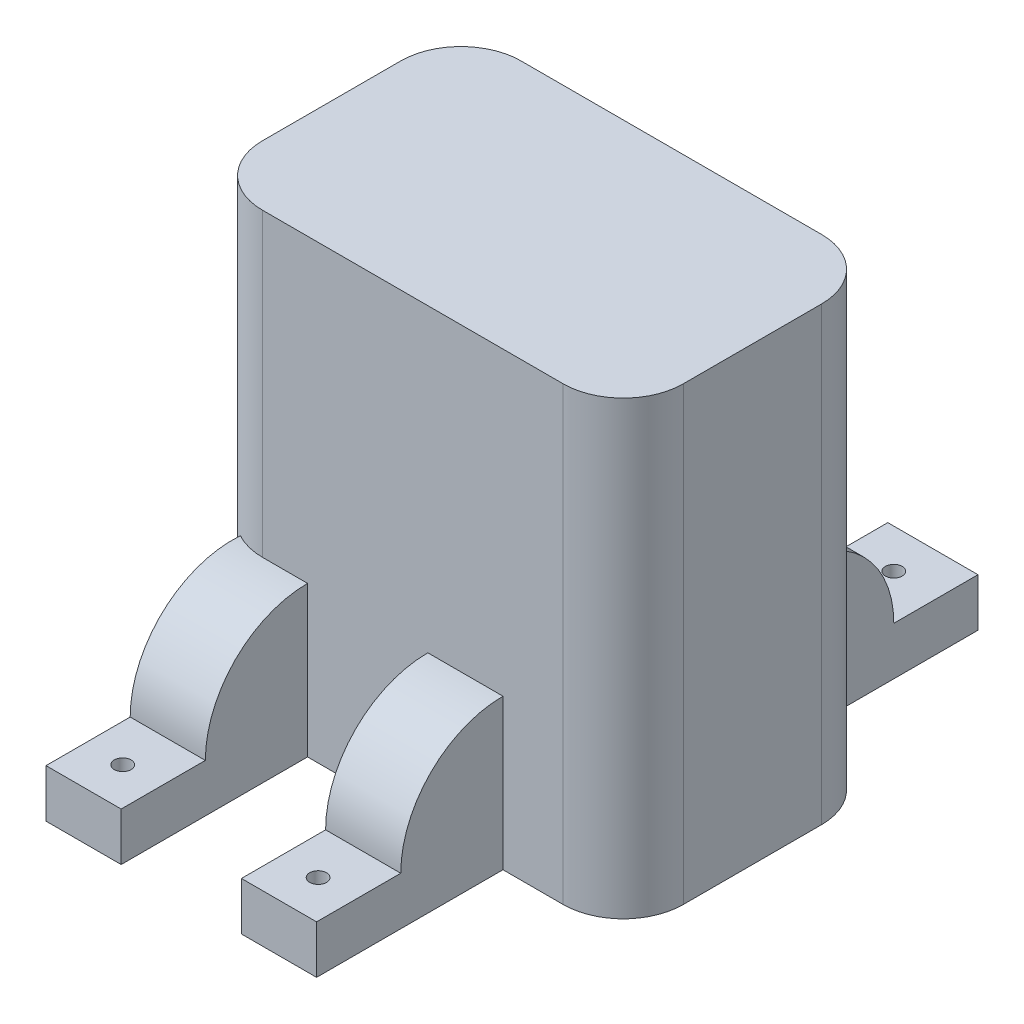
ISO-10303-21;
HEADER;
FILE_DESCRIPTION(('STEP AP214'),'2;1');
FILE_NAME('part.step','',(''),(''),'','','');
FILE_SCHEMA(('AUTOMOTIVE_DESIGN { 1 0 10303 214 1 1 1 1 }'));
ENDSEC;
DATA;
#1=APPLICATION_CONTEXT('core data for automotive mechanical design processes');
#2=APPLICATION_PROTOCOL_DEFINITION('international standard','automotive_design',2000,#1);
#3=PRODUCT_CONTEXT('',#1,'mechanical');
#4=PRODUCT('Part','Part','',(#3));
#5=PRODUCT_RELATED_PRODUCT_CATEGORY('part','',(#4));
#6=PRODUCT_DEFINITION_FORMATION('','',#4);
#7=PRODUCT_DEFINITION_CONTEXT('part definition',#1,'design');
#8=PRODUCT_DEFINITION('design','',#6,#7);
#9=PRODUCT_DEFINITION_SHAPE('','',#8);
#10=(LENGTH_UNIT() NAMED_UNIT(*) SI_UNIT(.MILLI.,.METRE.));
#11=(NAMED_UNIT(*) PLANE_ANGLE_UNIT() SI_UNIT($,.RADIAN.));
#12=(NAMED_UNIT(*) SI_UNIT($,.STERADIAN.) SOLID_ANGLE_UNIT());
#13=UNCERTAINTY_MEASURE_WITH_UNIT(LENGTH_MEASURE(1.E-05),#10,'distance_accuracy_value','');
#14=(GEOMETRIC_REPRESENTATION_CONTEXT(3) GLOBAL_UNCERTAINTY_ASSIGNED_CONTEXT((#13)) GLOBAL_UNIT_ASSIGNED_CONTEXT((#10,
#11,#12)) REPRESENTATION_CONTEXT('',''));
#15=CARTESIAN_POINT('',(0.,0.,0.));
#16=DIRECTION('',(0.,0.,1.));
#17=DIRECTION('',(1.,0.,0.));
#18=AXIS2_PLACEMENT_3D('',#15,#16,#17);
#19=CARTESIAN_POINT('',(0.,0.,0.));
#20=DIRECTION('',(0.,-1.,0.));
#21=DIRECTION('',(0.,0.,-1.));
#22=AXIS2_PLACEMENT_3D('',#19,#20,#21);
#23=PLANE('',#22);
#24=CARTESIAN_POINT('',(4.75,0.,-6.75));
#25=DIRECTION('',(0.,1.,0.));
#26=DIRECTION('',(0.,0.,1.));
#27=AXIS2_PLACEMENT_3D('',#24,#25,#26);
#28=CIRCLE('',#27,0.140000000000001);
#29=CARTESIAN_POINT('',(4.75,0.,-6.61));
#30=VERTEX_POINT('',#29);
#31=EDGE_CURVE('E269',#30,#30,#28,.T.);
#32=ORIENTED_EDGE('',*,*,#31,.T.);
#33=EDGE_LOOP('',(#32));
#34=FACE_BOUND('',#33,.T.);
#35=CARTESIAN_POINT('',(1.125,0.,2.45));
#36=DIRECTION('',(0.,1.,0.));
#37=DIRECTION('',(0.,0.,1.));
#38=AXIS2_PLACEMENT_3D('',#35,#36,#37);
#39=CIRCLE('',#38,0.14);
#40=CARTESIAN_POINT('',(1.125,0.,2.59));
#41=VERTEX_POINT('',#40);
#42=EDGE_CURVE('E278',#41,#41,#39,.T.);
#43=ORIENTED_EDGE('',*,*,#42,.T.);
#44=EDGE_LOOP('',(#43));
#45=FACE_BOUND('',#44,.T.);
#46=CARTESIAN_POINT('',(4.375,0.,2.45));
#47=DIRECTION('',(0.,1.,0.));
#48=DIRECTION('',(0.,0.,1.));
#49=AXIS2_PLACEMENT_3D('',#46,#47,#48);
#50=CIRCLE('',#49,0.14);
#51=CARTESIAN_POINT('',(4.375,0.,2.59));
#52=VERTEX_POINT('',#51);
#53=EDGE_CURVE('E266',#52,#52,#50,.T.);
#54=ORIENTED_EDGE('',*,*,#53,.T.);
#55=EDGE_LOOP('',(#54));
#56=FACE_BOUND('',#55,.T.);
#57=DIRECTION('',(0.,0.,-1.));
#58=VECTOR('',#57,1.);
#59=CARTESIAN_POINT('',(0.5,0.,3.1));
#60=LINE('',#59,#58);
#61=CARTESIAN_POINT('',(0.5,0.,3.1));
#62=VERTEX_POINT('',#61);
#63=CARTESIAN_POINT('',(0.5,0.,-0.133974596215561));
#64=VERTEX_POINT('',#63);
#65=EDGE_CURVE('E318',#62,#64,#60,.T.);
#66=ORIENTED_EDGE('',*,*,#65,.T.);
#67=CARTESIAN_POINT('',(1.,0.,-1.));
#68=DIRECTION('',(0.,-1.,0.));
#69=DIRECTION('',(0.,0.,-1.));
#70=AXIS2_PLACEMENT_3D('',#67,#68,#69);
#71=CIRCLE('',#70,1.);
#72=CARTESIAN_POINT('',(0.,0.,-1.));
#73=VERTEX_POINT('',#72);
#74=EDGE_CURVE('E420',#64,#73,#71,.T.);
#75=ORIENTED_EDGE('',*,*,#74,.T.);
#76=DIRECTION('',(0.,0.,1.));
#77=VECTOR('',#76,1.);
#78=CARTESIAN_POINT('',(0.,0.,0.));
#79=LINE('',#78,#77);
#80=CARTESIAN_POINT('',(0.,0.,-3.3));
#81=VERTEX_POINT('',#80);
#82=EDGE_CURVE('E359',#81,#73,#79,.T.);
#83=ORIENTED_EDGE('',*,*,#82,.F.);
#84=CARTESIAN_POINT('',(1.,0.,-3.3));
#85=DIRECTION('',(0.,-1.,0.));
#86=DIRECTION('',(0.,0.,-1.));
#87=AXIS2_PLACEMENT_3D('',#84,#85,#86);
#88=CIRCLE('',#87,1.);
#89=CARTESIAN_POINT('',(1.,0.,-4.3));
#90=VERTEX_POINT('',#89);
#91=EDGE_CURVE('E418',#81,#90,#88,.T.);
#92=ORIENTED_EDGE('',*,*,#91,.T.);
#93=DIRECTION('',(-1.,0.,0.));
#94=VECTOR('',#93,1.);
#95=CARTESIAN_POINT('',(0.,0.,-4.3));
#96=LINE('',#95,#94);
#97=CARTESIAN_POINT('',(4.,0.,-4.3));
#98=VERTEX_POINT('',#97);
#99=EDGE_CURVE('E408',#98,#90,#96,.T.);
#100=ORIENTED_EDGE('',*,*,#99,.F.);
#101=DIRECTION('',(0.,0.,1.));
#102=VECTOR('',#101,1.);
#103=CARTESIAN_POINT('',(4.,0.,-7.4));
#104=LINE('',#103,#102);
#105=CARTESIAN_POINT('',(4.,0.,-7.4));
#106=VERTEX_POINT('',#105);
#107=EDGE_CURVE('E302',#106,#98,#104,.T.);
#108=ORIENTED_EDGE('',*,*,#107,.F.);
#109=DIRECTION('',(-1.,0.,0.));
#110=VECTOR('',#109,1.);
#111=CARTESIAN_POINT('',(0.,0.,-7.4));
#112=LINE('',#111,#110);
#113=CARTESIAN_POINT('',(5.5,0.,-7.4));
#114=VERTEX_POINT('',#113);
#115=EDGE_CURVE('E229',#114,#106,#112,.T.);
#116=ORIENTED_EDGE('',*,*,#115,.F.);
#117=DIRECTION('',(0.,0.,1.));
#118=VECTOR('',#117,1.);
#119=CARTESIAN_POINT('',(5.5,0.,-7.4));
#120=LINE('',#119,#118);
#121=CARTESIAN_POINT('',(5.5,0.,-4.3));
#122=VERTEX_POINT('',#121);
#123=EDGE_CURVE('E295',#114,#122,#120,.T.);
#124=ORIENTED_EDGE('',*,*,#123,.T.);
#125=CARTESIAN_POINT('',(6.,0.,-4.3));
#126=VERTEX_POINT('',#125);
#127=EDGE_CURVE('E226',#126,#122,#96,.T.);
#128=ORIENTED_EDGE('',*,*,#127,.F.);
#129=CARTESIAN_POINT('',(6.,0.,-3.3));
#130=DIRECTION('',(0.,-1.,0.));
#131=DIRECTION('',(0.,0.,-1.));
#132=AXIS2_PLACEMENT_3D('',#129,#130,#131);
#133=CIRCLE('',#132,1.);
#134=CARTESIAN_POINT('',(7.,0.,-3.3));
#135=VERTEX_POINT('',#134);
#136=EDGE_CURVE('E416',#126,#135,#133,.T.);
#137=ORIENTED_EDGE('',*,*,#136,.T.);
#138=DIRECTION('',(0.,0.,-1.));
#139=VECTOR('',#138,1.);
#140=CARTESIAN_POINT('',(7.,0.,0.));
#141=LINE('',#140,#139);
#142=CARTESIAN_POINT('',(7.,0.,-1.));
#143=VERTEX_POINT('',#142);
#144=EDGE_CURVE('E405',#143,#135,#141,.T.);
#145=ORIENTED_EDGE('',*,*,#144,.F.);
#146=CARTESIAN_POINT('',(6.,0.,-1.));
#147=DIRECTION('',(0.,-1.,0.));
#148=DIRECTION('',(0.,0.,-1.));
#149=AXIS2_PLACEMENT_3D('',#146,#147,#148);
#150=CIRCLE('',#149,1.);
#151=CARTESIAN_POINT('',(6.,0.,0.));
#152=VERTEX_POINT('',#151);
#153=EDGE_CURVE('E414',#143,#152,#150,.T.);
#154=ORIENTED_EDGE('',*,*,#153,.T.);
#155=DIRECTION('',(1.,0.,0.));
#156=VECTOR('',#155,1.);
#157=CARTESIAN_POINT('',(0.,0.,0.));
#158=LINE('',#157,#156);
#159=CARTESIAN_POINT('',(5.,0.,0.));
#160=VERTEX_POINT('',#159);
#161=EDGE_CURVE('E401',#160,#152,#158,.T.);
#162=ORIENTED_EDGE('',*,*,#161,.F.);
#163=DIRECTION('',(0.,0.,-1.));
#164=VECTOR('',#163,1.);
#165=CARTESIAN_POINT('',(5.,0.,3.1));
#166=LINE('',#165,#164);
#167=CARTESIAN_POINT('',(5.,0.,3.1));
#168=VERTEX_POINT('',#167);
#169=EDGE_CURVE('E305',#168,#160,#166,.T.);
#170=ORIENTED_EDGE('',*,*,#169,.F.);
#171=DIRECTION('',(1.,0.,0.));
#172=VECTOR('',#171,1.);
#173=CARTESIAN_POINT('',(0.,0.,3.1));
#174=LINE('',#173,#172);
#175=CARTESIAN_POINT('',(3.75,0.,3.1));
#176=VERTEX_POINT('',#175);
#177=EDGE_CURVE('E345',#176,#168,#174,.T.);
#178=ORIENTED_EDGE('',*,*,#177,.F.);
#179=DIRECTION('',(0.,0.,-1.));
#180=VECTOR('',#179,1.);
#181=CARTESIAN_POINT('',(3.75,0.,3.1));
#182=LINE('',#181,#180);
#183=CARTESIAN_POINT('',(3.75,0.,0.));
#184=VERTEX_POINT('',#183);
#185=EDGE_CURVE('E339',#176,#184,#182,.T.);
#186=ORIENTED_EDGE('',*,*,#185,.T.);
#187=CARTESIAN_POINT('',(1.75,0.,0.));
#188=VERTEX_POINT('',#187);
#189=EDGE_CURVE('E404',#188,#184,#158,.T.);
#190=ORIENTED_EDGE('',*,*,#189,.F.);
#191=DIRECTION('',(0.,0.,-1.));
#192=VECTOR('',#191,1.);
#193=CARTESIAN_POINT('',(1.75,0.,3.1));
#194=LINE('',#193,#192);
#195=CARTESIAN_POINT('',(1.75,0.,3.1));
#196=VERTEX_POINT('',#195);
#197=EDGE_CURVE('E327',#196,#188,#194,.T.);
#198=ORIENTED_EDGE('',*,*,#197,.F.);
#199=DIRECTION('',(1.,0.,0.));
#200=VECTOR('',#199,1.);
#201=CARTESIAN_POINT('',(0.,0.,3.1));
#202=LINE('',#201,#200);
#203=EDGE_CURVE('E306',#62,#196,#202,.T.);
#204=ORIENTED_EDGE('',*,*,#203,.F.);
#205=EDGE_LOOP('',(#66,#75,#83,#92,#100,#108,#116,#124,#128,#137,#145,#154,#162,#170,#178,#186,
#190,#198,#204));
#206=FACE_BOUND('',#205,.T.);
#207=DIRECTION('',(-1.,0.,0.));
#208=VECTOR('',#207,1.);
#209=CARTESIAN_POINT('',(0.,0.,-3.3));
#210=LINE('',#209,#208);
#211=CARTESIAN_POINT('',(6.,0.,-3.3));
#212=VERTEX_POINT('',#211);
#213=CARTESIAN_POINT('',(1.,0.,-3.3));
#214=VERTEX_POINT('',#213);
#215=EDGE_CURVE('E365',#212,#214,#210,.T.);
#216=ORIENTED_EDGE('',*,*,#215,.T.);
#217=DIRECTION('',(0.,0.,1.));
#218=VECTOR('',#217,1.);
#219=CARTESIAN_POINT('',(1.,0.,0.));
#220=LINE('',#219,#218);
#221=CARTESIAN_POINT('',(1.,0.,-1.));
#222=VERTEX_POINT('',#221);
#223=EDGE_CURVE('E330',#214,#222,#220,.T.);
#224=ORIENTED_EDGE('',*,*,#223,.T.);
#225=DIRECTION('',(1.,0.,0.));
#226=VECTOR('',#225,1.);
#227=CARTESIAN_POINT('',(0.,0.,-1.));
#228=LINE('',#227,#226);
#229=CARTESIAN_POINT('',(6.,0.,-1.));
#230=VERTEX_POINT('',#229);
#231=EDGE_CURVE('E379',#222,#230,#228,.T.);
#232=ORIENTED_EDGE('',*,*,#231,.T.);
#233=DIRECTION('',(0.,0.,-1.));
#234=VECTOR('',#233,1.);
#235=CARTESIAN_POINT('',(6.,0.,0.));
#236=LINE('',#235,#234);
#237=EDGE_CURVE('E382',#230,#212,#236,.T.);
#238=ORIENTED_EDGE('',*,*,#237,.T.);
#239=EDGE_LOOP('',(#216,#224,#232,#238));
#240=FACE_BOUND('',#239,.T.);
#241=ADVANCED_FACE('F39',(#34,#45,#56,#206,#240),#23,.T.);
#242=CARTESIAN_POINT('',(0.,7.5,0.));
#243=DIRECTION('',(1.,0.,0.));
#244=DIRECTION('',(0.,0.,-1.));
#245=AXIS2_PLACEMENT_3D('',#242,#243,#244);
#246=PLANE('',#245);
#247=ORIENTED_EDGE('',*,*,#82,.T.);
#248=DIRECTION('',(0.,-1.,0.));
#249=VECTOR('',#248,1.);
#250=CARTESIAN_POINT('',(0.,7.5,-1.));
#251=LINE('',#250,#249);
#252=CARTESIAN_POINT('',(0.,7.5,-1.));
#253=VERTEX_POINT('',#252);
#254=EDGE_CURVE('E425',#73,#253,#251,.F.);
#255=ORIENTED_EDGE('',*,*,#254,.T.);
#256=DIRECTION('',(0.,0.,1.));
#257=VECTOR('',#256,1.);
#258=CARTESIAN_POINT('',(0.,7.5,0.));
#259=LINE('',#258,#257);
#260=CARTESIAN_POINT('',(0.,7.5,-3.3));
#261=VERTEX_POINT('',#260);
#262=EDGE_CURVE('E387',#261,#253,#259,.T.);
#263=ORIENTED_EDGE('',*,*,#262,.F.);
#264=DIRECTION('',(0.,-1.,0.));
#265=VECTOR('',#264,1.);
#266=CARTESIAN_POINT('',(0.,7.5,-3.3));
#267=LINE('',#266,#265);
#268=EDGE_CURVE('E422',#261,#81,#267,.T.);
#269=ORIENTED_EDGE('',*,*,#268,.T.);
#270=EDGE_LOOP('',(#247,#255,#263,#269));
#271=FACE_BOUND('',#270,.T.);
#272=ADVANCED_FACE('F545',(#271),#246,.F.);
#273=CARTESIAN_POINT('',(0.,7.5,0.));
#274=DIRECTION('',(0.,0.,-1.));
#275=DIRECTION('',(-1.,0.,0.));
#276=AXIS2_PLACEMENT_3D('',#273,#274,#275);
#277=PLANE('',#276);
#278=DIRECTION('',(1.,0.,0.));
#279=VECTOR('',#278,1.);
#280=CARTESIAN_POINT('',(0.,7.5,0.));
#281=LINE('',#280,#279);
#282=CARTESIAN_POINT('',(1.,7.5,0.));
#283=VERTEX_POINT('',#282);
#284=CARTESIAN_POINT('',(6.,7.5,0.));
#285=VERTEX_POINT('',#284);
#286=EDGE_CURVE('E390',#283,#285,#281,.T.);
#287=ORIENTED_EDGE('',*,*,#286,.F.);
#288=DIRECTION('',(0.,-1.,0.));
#289=VECTOR('',#288,1.);
#290=CARTESIAN_POINT('',(1.,7.5,0.));
#291=LINE('',#290,#289);
#292=CARTESIAN_POINT('',(1.,2.5,0.));
#293=VERTEX_POINT('',#292);
#294=EDGE_CURVE('E411',#283,#293,#291,.T.);
#295=ORIENTED_EDGE('',*,*,#294,.T.);
#296=DIRECTION('',(-1.,0.,0.));
#297=VECTOR('',#296,1.);
#298=CARTESIAN_POINT('',(4.15416305603426,2.5,0.));
#299=LINE('',#298,#297);
#300=CARTESIAN_POINT('',(1.75,2.5,0.));
#301=VERTEX_POINT('',#300);
#302=EDGE_CURVE('E251',#301,#293,#299,.T.);
#303=ORIENTED_EDGE('',*,*,#302,.F.);
#304=DIRECTION('',(0.,1.,0.));
#305=VECTOR('',#304,1.);
#306=CARTESIAN_POINT('',(1.75,7.5,0.));
#307=LINE('',#306,#305);
#308=EDGE_CURVE('E310',#188,#301,#307,.T.);
#309=ORIENTED_EDGE('',*,*,#308,.F.);
#310=ORIENTED_EDGE('',*,*,#189,.T.);
#311=DIRECTION('',(0.,1.,0.));
#312=VECTOR('',#311,1.);
#313=CARTESIAN_POINT('',(3.75,7.5,0.));
#314=LINE('',#313,#312);
#315=CARTESIAN_POINT('',(3.75,2.5,0.));
#316=VERTEX_POINT('',#315);
#317=EDGE_CURVE('E343',#184,#316,#314,.T.);
#318=ORIENTED_EDGE('',*,*,#317,.T.);
#319=DIRECTION('',(1.,0.,0.));
#320=VECTOR('',#319,1.);
#321=CARTESIAN_POINT('',(1.34583694396574,2.5,0.));
#322=LINE('',#321,#320);
#323=CARTESIAN_POINT('',(5.,2.5,0.));
#324=VERTEX_POINT('',#323);
#325=EDGE_CURVE('E261',#316,#324,#322,.T.);
#326=ORIENTED_EDGE('',*,*,#325,.T.);
#327=DIRECTION('',(0.,1.,0.));
#328=VECTOR('',#327,1.);
#329=CARTESIAN_POINT('',(5.,7.5,0.));
#330=LINE('',#329,#328);
#331=EDGE_CURVE('E320',#160,#324,#330,.T.);
#332=ORIENTED_EDGE('',*,*,#331,.F.);
#333=ORIENTED_EDGE('',*,*,#161,.T.);
#334=DIRECTION('',(0.,-1.,0.));
#335=VECTOR('',#334,1.);
#336=CARTESIAN_POINT('',(6.,7.5,0.));
#337=LINE('',#336,#335);
#338=EDGE_CURVE('E398',#152,#285,#337,.F.);
#339=ORIENTED_EDGE('',*,*,#338,.T.);
#340=EDGE_LOOP('',(#287,#295,#303,#309,#310,#318,#326,#332,#333,#339));
#341=FACE_BOUND('',#340,.T.);
#342=ADVANCED_FACE('F552',(#341),#277,.F.);
#343=CARTESIAN_POINT('',(7.,7.5,0.));
#344=DIRECTION('',(-1.,0.,0.));
#345=DIRECTION('',(0.,0.,1.));
#346=AXIS2_PLACEMENT_3D('',#343,#344,#345);
#347=PLANE('',#346);
#348=ORIENTED_EDGE('',*,*,#144,.T.);
#349=DIRECTION('',(0.,-1.,0.));
#350=VECTOR('',#349,1.);
#351=CARTESIAN_POINT('',(7.,7.5,-3.3));
#352=LINE('',#351,#350);
#353=CARTESIAN_POINT('',(7.,7.5,-3.3));
#354=VERTEX_POINT('',#353);
#355=EDGE_CURVE('E441',#135,#354,#352,.F.);
#356=ORIENTED_EDGE('',*,*,#355,.T.);
#357=DIRECTION('',(0.,0.,-1.));
#358=VECTOR('',#357,1.);
#359=CARTESIAN_POINT('',(7.,7.5,0.));
#360=LINE('',#359,#358);
#361=CARTESIAN_POINT('',(7.,7.5,-1.));
#362=VERTEX_POINT('',#361);
#363=EDGE_CURVE('E393',#362,#354,#360,.T.);
#364=ORIENTED_EDGE('',*,*,#363,.F.);
#365=DIRECTION('',(0.,-1.,0.));
#366=VECTOR('',#365,1.);
#367=CARTESIAN_POINT('',(7.,7.5,-1.));
#368=LINE('',#367,#366);
#369=EDGE_CURVE('E438',#362,#143,#368,.T.);
#370=ORIENTED_EDGE('',*,*,#369,.T.);
#371=EDGE_LOOP('',(#348,#356,#364,#370));
#372=FACE_BOUND('',#371,.T.);
#373=ADVANCED_FACE('F549',(#372),#347,.F.);
#374=CARTESIAN_POINT('',(0.,7.5,-4.3));
#375=DIRECTION('',(0.,0.,1.));
#376=DIRECTION('',(1.,0.,0.));
#377=AXIS2_PLACEMENT_3D('',#374,#375,#376);
#378=PLANE('',#377);
#379=ORIENTED_EDGE('',*,*,#99,.T.);
#380=DIRECTION('',(0.,-1.,0.));
#381=VECTOR('',#380,1.);
#382=CARTESIAN_POINT('',(1.,7.5,-4.3));
#383=LINE('',#382,#381);
#384=CARTESIAN_POINT('',(1.,7.5,-4.3));
#385=VERTEX_POINT('',#384);
#386=EDGE_CURVE('E61',#90,#385,#383,.F.);
#387=ORIENTED_EDGE('',*,*,#386,.T.);
#388=DIRECTION('',(-1.,0.,0.));
#389=VECTOR('',#388,1.);
#390=CARTESIAN_POINT('',(0.,7.5,-4.3));
#391=LINE('',#390,#389);
#392=CARTESIAN_POINT('',(6.,7.5,-4.3));
#393=VERTEX_POINT('',#392);
#394=EDGE_CURVE('E396',#393,#385,#391,.T.);
#395=ORIENTED_EDGE('',*,*,#394,.F.);
#396=DIRECTION('',(0.,-1.,0.));
#397=VECTOR('',#396,1.);
#398=CARTESIAN_POINT('',(6.,7.5,-4.3));
#399=LINE('',#398,#397);
#400=EDGE_CURVE('E435',#393,#126,#399,.T.);
#401=ORIENTED_EDGE('',*,*,#400,.T.);
#402=ORIENTED_EDGE('',*,*,#127,.T.);
#403=DIRECTION('',(0.,1.,0.));
#404=VECTOR('',#403,1.);
#405=CARTESIAN_POINT('',(5.5,7.5,-4.3));
#406=LINE('',#405,#404);
#407=CARTESIAN_POINT('',(5.5,2.5,-4.3));
#408=VERTEX_POINT('',#407);
#409=EDGE_CURVE('E219',#122,#408,#406,.T.);
#410=ORIENTED_EDGE('',*,*,#409,.T.);
#411=DIRECTION('',(-1.,0.,0.));
#412=VECTOR('',#411,1.);
#413=CARTESIAN_POINT('',(7.90416305603426,2.5,-4.3));
#414=LINE('',#413,#412);
#415=CARTESIAN_POINT('',(4.,2.5,-4.3));
#416=VERTEX_POINT('',#415);
#417=EDGE_CURVE('E223',#408,#416,#414,.T.);
#418=ORIENTED_EDGE('',*,*,#417,.T.);
#419=DIRECTION('',(0.,1.,0.));
#420=VECTOR('',#419,1.);
#421=CARTESIAN_POINT('',(4.,7.5,-4.3));
#422=LINE('',#421,#420);
#423=EDGE_CURVE('E230',#98,#416,#422,.T.);
#424=ORIENTED_EDGE('',*,*,#423,.F.);
#425=EDGE_LOOP('',(#379,#387,#395,#401,#402,#410,#418,#424));
#426=FACE_BOUND('',#425,.T.);
#427=ADVANCED_FACE('F221',(#426),#378,.F.);
#428=CARTESIAN_POINT('',(0.,7.5,0.));
#429=DIRECTION('',(0.,-1.,0.));
#430=DIRECTION('',(0.,0.,-1.));
#431=AXIS2_PLACEMENT_3D('',#428,#429,#430);
#432=PLANE('',#431);
#433=ORIENTED_EDGE('',*,*,#262,.T.);
#434=CARTESIAN_POINT('',(1.,7.5,-1.));
#435=DIRECTION('',(0.,-1.,0.));
#436=DIRECTION('',(0.,0.,-1.));
#437=AXIS2_PLACEMENT_3D('',#434,#435,#436);
#438=CIRCLE('',#437,1.);
#439=EDGE_CURVE('E433',#253,#283,#438,.F.);
#440=ORIENTED_EDGE('',*,*,#439,.T.);
#441=ORIENTED_EDGE('',*,*,#286,.T.);
#442=CARTESIAN_POINT('',(6.,7.5,-1.));
#443=DIRECTION('',(0.,-1.,0.));
#444=DIRECTION('',(0.,0.,-1.));
#445=AXIS2_PLACEMENT_3D('',#442,#443,#444);
#446=CIRCLE('',#445,1.);
#447=EDGE_CURVE('E427',#285,#362,#446,.F.);
#448=ORIENTED_EDGE('',*,*,#447,.T.);
#449=ORIENTED_EDGE('',*,*,#363,.T.);
#450=CARTESIAN_POINT('',(6.,7.5,-3.3));
#451=DIRECTION('',(0.,-1.,0.));
#452=DIRECTION('',(0.,0.,-1.));
#453=AXIS2_PLACEMENT_3D('',#450,#451,#452);
#454=CIRCLE('',#453,1.);
#455=EDGE_CURVE('E429',#354,#393,#454,.F.);
#456=ORIENTED_EDGE('',*,*,#455,.T.);
#457=ORIENTED_EDGE('',*,*,#394,.T.);
#458=CARTESIAN_POINT('',(1.,7.5,-3.3));
#459=DIRECTION('',(0.,-1.,0.));
#460=DIRECTION('',(0.,0.,-1.));
#461=AXIS2_PLACEMENT_3D('',#458,#459,#460);
#462=CIRCLE('',#461,1.);
#463=EDGE_CURVE('E431',#385,#261,#462,.F.);
#464=ORIENTED_EDGE('',*,*,#463,.T.);
#465=EDGE_LOOP('',(#433,#440,#441,#448,#449,#456,#457,#464));
#466=FACE_BOUND('',#465,.T.);
#467=ADVANCED_FACE('F524',(#466),#432,.F.);
#468=CARTESIAN_POINT('',(1.,7.5,0.));
#469=DIRECTION('',(1.,0.,0.));
#470=DIRECTION('',(0.,0.,-1.));
#471=AXIS2_PLACEMENT_3D('',#468,#469,#470);
#472=PLANE('',#471);
#473=ORIENTED_EDGE('',*,*,#223,.F.);
#474=DIRECTION('',(0.,-1.,0.));
#475=VECTOR('',#474,1.);
#476=CARTESIAN_POINT('',(1.,7.5,-3.3));
#477=LINE('',#476,#475);
#478=CARTESIAN_POINT('',(1.,6.5,-3.3));
#479=VERTEX_POINT('',#478);
#480=EDGE_CURVE('E366',#479,#214,#477,.T.);
#481=ORIENTED_EDGE('',*,*,#480,.F.);
#482=DIRECTION('',(0.,0.,1.));
#483=VECTOR('',#482,1.);
#484=CARTESIAN_POINT('',(1.,6.5,0.));
#485=LINE('',#484,#483);
#486=CARTESIAN_POINT('',(1.,6.5,-1.));
#487=VERTEX_POINT('',#486);
#488=EDGE_CURVE('E361',#479,#487,#485,.T.);
#489=ORIENTED_EDGE('',*,*,#488,.T.);
#490=DIRECTION('',(0.,-1.,0.));
#491=VECTOR('',#490,1.);
#492=CARTESIAN_POINT('',(1.,7.5,-1.));
#493=LINE('',#492,#491);
#494=EDGE_CURVE('E356',#487,#222,#493,.T.);
#495=ORIENTED_EDGE('',*,*,#494,.T.);
#496=EDGE_LOOP('',(#473,#481,#489,#495));
#497=FACE_BOUND('',#496,.T.);
#498=ADVANCED_FACE('F520',(#497),#472,.T.);
#499=CARTESIAN_POINT('',(0.,7.5,-1.));
#500=DIRECTION('',(0.,0.,-1.));
#501=DIRECTION('',(-1.,0.,0.));
#502=AXIS2_PLACEMENT_3D('',#499,#500,#501);
#503=PLANE('',#502);
#504=ORIENTED_EDGE('',*,*,#231,.F.);
#505=ORIENTED_EDGE('',*,*,#494,.F.);
#506=DIRECTION('',(1.,0.,0.));
#507=VECTOR('',#506,1.);
#508=CARTESIAN_POINT('',(0.,6.5,-1.));
#509=LINE('',#508,#507);
#510=CARTESIAN_POINT('',(6.,6.5,-1.));
#511=VERTEX_POINT('',#510);
#512=EDGE_CURVE('E364',#487,#511,#509,.T.);
#513=ORIENTED_EDGE('',*,*,#512,.T.);
#514=DIRECTION('',(0.,-1.,0.));
#515=VECTOR('',#514,1.);
#516=CARTESIAN_POINT('',(6.,7.5,-1.));
#517=LINE('',#516,#515);
#518=EDGE_CURVE('E360',#511,#230,#517,.T.);
#519=ORIENTED_EDGE('',*,*,#518,.T.);
#520=EDGE_LOOP('',(#504,#505,#513,#519));
#521=FACE_BOUND('',#520,.T.);
#522=ADVANCED_FACE('F523',(#521),#503,.T.);
#523=CARTESIAN_POINT('',(6.,7.5,0.));
#524=DIRECTION('',(-1.,0.,0.));
#525=DIRECTION('',(0.,0.,1.));
#526=AXIS2_PLACEMENT_3D('',#523,#524,#525);
#527=PLANE('',#526);
#528=ORIENTED_EDGE('',*,*,#237,.F.);
#529=ORIENTED_EDGE('',*,*,#518,.F.);
#530=DIRECTION('',(0.,0.,-1.));
#531=VECTOR('',#530,1.);
#532=CARTESIAN_POINT('',(6.,6.5,0.));
#533=LINE('',#532,#531);
#534=CARTESIAN_POINT('',(6.,6.5,-3.3));
#535=VERTEX_POINT('',#534);
#536=EDGE_CURVE('E373',#511,#535,#533,.T.);
#537=ORIENTED_EDGE('',*,*,#536,.T.);
#538=DIRECTION('',(0.,-1.,0.));
#539=VECTOR('',#538,1.);
#540=CARTESIAN_POINT('',(6.,7.5,-3.3));
#541=LINE('',#540,#539);
#542=EDGE_CURVE('E368',#535,#212,#541,.T.);
#543=ORIENTED_EDGE('',*,*,#542,.T.);
#544=EDGE_LOOP('',(#528,#529,#537,#543));
#545=FACE_BOUND('',#544,.T.);
#546=ADVANCED_FACE('F528',(#545),#527,.T.);
#547=CARTESIAN_POINT('',(0.,7.5,-3.3));
#548=DIRECTION('',(0.,0.,1.));
#549=DIRECTION('',(1.,0.,0.));
#550=AXIS2_PLACEMENT_3D('',#547,#548,#549);
#551=PLANE('',#550);
#552=ORIENTED_EDGE('',*,*,#215,.F.);
#553=ORIENTED_EDGE('',*,*,#542,.F.);
#554=DIRECTION('',(-1.,0.,0.));
#555=VECTOR('',#554,1.);
#556=CARTESIAN_POINT('',(0.,6.5,-3.3));
#557=LINE('',#556,#555);
#558=EDGE_CURVE('E369',#535,#479,#557,.T.);
#559=ORIENTED_EDGE('',*,*,#558,.T.);
#560=ORIENTED_EDGE('',*,*,#480,.T.);
#561=EDGE_LOOP('',(#552,#553,#559,#560));
#562=FACE_BOUND('',#561,.T.);
#563=ADVANCED_FACE('F532',(#562),#551,.T.);
#564=CARTESIAN_POINT('',(0.,6.5,0.));
#565=DIRECTION('',(0.,-1.,0.));
#566=DIRECTION('',(0.,0.,-1.));
#567=AXIS2_PLACEMENT_3D('',#564,#565,#566);
#568=PLANE('',#567);
#569=ORIENTED_EDGE('',*,*,#488,.F.);
#570=ORIENTED_EDGE('',*,*,#558,.F.);
#571=ORIENTED_EDGE('',*,*,#536,.F.);
#572=ORIENTED_EDGE('',*,*,#512,.F.);
#573=EDGE_LOOP('',(#569,#570,#571,#572));
#574=FACE_BOUND('',#573,.T.);
#575=ADVANCED_FACE('F508',(#574),#568,.T.);
#576=CARTESIAN_POINT('',(5.,7.5,3.1));
#577=DIRECTION('',(-1.,0.,0.));
#578=DIRECTION('',(0.,0.,1.));
#579=AXIS2_PLACEMENT_3D('',#576,#577,#578);
#580=PLANE('',#579);
#581=ORIENTED_EDGE('',*,*,#331,.T.);
#582=CARTESIAN_POINT('',(5.,0.8,0.));
#583=DIRECTION('',(1.,0.,0.));
#584=DIRECTION('',(0.,0.,1.));
#585=AXIS2_PLACEMENT_3D('',#582,#583,#584);
#586=CIRCLE('',#585,1.7);
#587=CARTESIAN_POINT('',(5.,0.8,1.7));
#588=VERTEX_POINT('',#587);
#589=EDGE_CURVE('E258',#324,#588,#586,.T.);
#590=ORIENTED_EDGE('',*,*,#589,.T.);
#591=DIRECTION('',(0.,0.,-1.));
#592=VECTOR('',#591,1.);
#593=CARTESIAN_POINT('',(5.,0.8,3.1));
#594=LINE('',#593,#592);
#595=CARTESIAN_POINT('',(5.,0.8,3.1));
#596=VERTEX_POINT('',#595);
#597=EDGE_CURVE('E333',#596,#588,#594,.T.);
#598=ORIENTED_EDGE('',*,*,#597,.F.);
#599=DIRECTION('',(0.,1.,0.));
#600=VECTOR('',#599,1.);
#601=CARTESIAN_POINT('',(5.,7.5,3.1));
#602=LINE('',#601,#600);
#603=EDGE_CURVE('E352',#168,#596,#602,.T.);
#604=ORIENTED_EDGE('',*,*,#603,.F.);
#605=ORIENTED_EDGE('',*,*,#169,.T.);
#606=EDGE_LOOP('',(#581,#590,#598,#604,#605));
#607=FACE_BOUND('',#606,.T.);
#608=ADVANCED_FACE('F504',(#607),#580,.F.);
#609=CARTESIAN_POINT('',(0.,0.8,3.1));
#610=DIRECTION('',(0.,1.,0.));
#611=DIRECTION('',(0.,0.,1.));
#612=AXIS2_PLACEMENT_3D('',#609,#610,#611);
#613=PLANE('',#612);
#614=DIRECTION('',(1.,0.,0.));
#615=VECTOR('',#614,1.);
#616=CARTESIAN_POINT('',(1.34583694396574,0.8,1.7));
#617=LINE('',#616,#615);
#618=CARTESIAN_POINT('',(3.75,0.8,1.7));
#619=VERTEX_POINT('',#618);
#620=EDGE_CURVE('E264',#619,#588,#617,.T.);
#621=ORIENTED_EDGE('',*,*,#620,.F.);
#622=DIRECTION('',(0.,0.,-1.));
#623=VECTOR('',#622,1.);
#624=CARTESIAN_POINT('',(3.75,0.8,3.1));
#625=LINE('',#624,#623);
#626=CARTESIAN_POINT('',(3.75,0.8,3.1));
#627=VERTEX_POINT('',#626);
#628=EDGE_CURVE('E336',#627,#619,#625,.T.);
#629=ORIENTED_EDGE('',*,*,#628,.F.);
#630=DIRECTION('',(1.,0.,0.));
#631=VECTOR('',#630,1.);
#632=CARTESIAN_POINT('',(0.,0.8,3.1));
#633=LINE('',#632,#631);
#634=EDGE_CURVE('E349',#627,#596,#633,.T.);
#635=ORIENTED_EDGE('',*,*,#634,.T.);
#636=ORIENTED_EDGE('',*,*,#597,.T.);
#637=EDGE_LOOP('',(#621,#629,#635,#636));
#638=FACE_BOUND('',#637,.T.);
#639=CARTESIAN_POINT('',(4.375,0.8,2.45));
#640=DIRECTION('',(0.,1.,0.));
#641=DIRECTION('',(0.,0.,1.));
#642=AXIS2_PLACEMENT_3D('',#639,#640,#641);
#643=CIRCLE('',#642,0.14);
#644=CARTESIAN_POINT('',(4.375,0.8,2.59));
#645=VERTEX_POINT('',#644);
#646=EDGE_CURVE('E281',#645,#645,#643,.T.);
#647=ORIENTED_EDGE('',*,*,#646,.F.);
#648=EDGE_LOOP('',(#647));
#649=FACE_BOUND('',#648,.T.);
#650=ADVANCED_FACE('F507',(#638,#649),#613,.T.);
#651=CARTESIAN_POINT('',(3.75,7.5,3.1));
#652=DIRECTION('',(-1.,0.,0.));
#653=DIRECTION('',(0.,0.,1.));
#654=AXIS2_PLACEMENT_3D('',#651,#652,#653);
#655=PLANE('',#654);
#656=ORIENTED_EDGE('',*,*,#317,.F.);
#657=ORIENTED_EDGE('',*,*,#185,.F.);
#658=DIRECTION('',(0.,1.,0.));
#659=VECTOR('',#658,1.);
#660=CARTESIAN_POINT('',(3.75,7.5,3.1));
#661=LINE('',#660,#659);
#662=EDGE_CURVE('E342',#176,#627,#661,.T.);
#663=ORIENTED_EDGE('',*,*,#662,.T.);
#664=ORIENTED_EDGE('',*,*,#628,.T.);
#665=CARTESIAN_POINT('',(3.75,0.8,0.));
#666=DIRECTION('',(-1.,0.,0.));
#667=DIRECTION('',(0.,0.,1.));
#668=AXIS2_PLACEMENT_3D('',#665,#666,#667);
#669=CIRCLE('',#668,1.7);
#670=EDGE_CURVE('E262',#316,#619,#669,.F.);
#671=ORIENTED_EDGE('',*,*,#670,.F.);
#672=EDGE_LOOP('',(#656,#657,#663,#664,#671));
#673=FACE_BOUND('',#672,.T.);
#674=ADVANCED_FACE('F512',(#673),#655,.T.);
#675=CARTESIAN_POINT('',(0.,0.,3.1));
#676=DIRECTION('',(0.,0.,1.));
#677=DIRECTION('',(1.,0.,0.));
#678=AXIS2_PLACEMENT_3D('',#675,#676,#677);
#679=PLANE('',#678);
#680=ORIENTED_EDGE('',*,*,#177,.T.);
#681=ORIENTED_EDGE('',*,*,#603,.T.);
#682=ORIENTED_EDGE('',*,*,#634,.F.);
#683=ORIENTED_EDGE('',*,*,#662,.F.);
#684=EDGE_LOOP('',(#680,#681,#682,#683));
#685=FACE_BOUND('',#684,.T.);
#686=ADVANCED_FACE('F502',(#685),#679,.T.);
#687=CARTESIAN_POINT('',(1.75,7.5,3.1));
#688=DIRECTION('',(-1.,0.,0.));
#689=DIRECTION('',(0.,0.,1.));
#690=AXIS2_PLACEMENT_3D('',#687,#688,#689);
#691=PLANE('',#690);
#692=ORIENTED_EDGE('',*,*,#308,.T.);
#693=CARTESIAN_POINT('',(1.75,0.8,0.));
#694=DIRECTION('',(-1.,0.,0.));
#695=DIRECTION('',(0.,0.,1.));
#696=AXIS2_PLACEMENT_3D('',#693,#694,#695);
#697=CIRCLE('',#696,1.7);
#698=CARTESIAN_POINT('',(1.75,0.8,1.7));
#699=VERTEX_POINT('',#698);
#700=EDGE_CURVE('E254',#301,#699,#697,.F.);
#701=ORIENTED_EDGE('',*,*,#700,.T.);
#702=DIRECTION('',(0.,0.,-1.));
#703=VECTOR('',#702,1.);
#704=CARTESIAN_POINT('',(1.75,0.8,3.1));
#705=LINE('',#704,#703);
#706=CARTESIAN_POINT('',(1.75,0.8,3.1));
#707=VERTEX_POINT('',#706);
#708=EDGE_CURVE('E324',#707,#699,#705,.T.);
#709=ORIENTED_EDGE('',*,*,#708,.F.);
#710=DIRECTION('',(0.,1.,0.));
#711=VECTOR('',#710,1.);
#712=CARTESIAN_POINT('',(1.75,7.5,3.1));
#713=LINE('',#712,#711);
#714=EDGE_CURVE('E309',#196,#707,#713,.T.);
#715=ORIENTED_EDGE('',*,*,#714,.F.);
#716=ORIENTED_EDGE('',*,*,#197,.T.);
#717=EDGE_LOOP('',(#692,#701,#709,#715,#716));
#718=FACE_BOUND('',#717,.T.);
#719=ADVANCED_FACE('F498',(#718),#691,.F.);
#720=CARTESIAN_POINT('',(0.,0.8,3.1));
#721=DIRECTION('',(0.,1.,0.));
#722=DIRECTION('',(0.,0.,1.));
#723=AXIS2_PLACEMENT_3D('',#720,#721,#722);
#724=PLANE('',#723);
#725=DIRECTION('',(-1.,0.,0.));
#726=VECTOR('',#725,1.);
#727=CARTESIAN_POINT('',(4.15416305603426,0.8,1.7));
#728=LINE('',#727,#726);
#729=CARTESIAN_POINT('',(0.5,0.8,1.7));
#730=VERTEX_POINT('',#729);
#731=EDGE_CURVE('E250',#699,#730,#728,.T.);
#732=ORIENTED_EDGE('',*,*,#731,.T.);
#733=DIRECTION('',(0.,0.,-1.));
#734=VECTOR('',#733,1.);
#735=CARTESIAN_POINT('',(0.5,0.8,3.1));
#736=LINE('',#735,#734);
#737=CARTESIAN_POINT('',(0.5,0.8,3.1));
#738=VERTEX_POINT('',#737);
#739=EDGE_CURVE('E322',#738,#730,#736,.T.);
#740=ORIENTED_EDGE('',*,*,#739,.F.);
#741=DIRECTION('',(1.,0.,0.));
#742=VECTOR('',#741,1.);
#743=CARTESIAN_POINT('',(0.,0.8,3.1));
#744=LINE('',#743,#742);
#745=EDGE_CURVE('E312',#738,#707,#744,.T.);
#746=ORIENTED_EDGE('',*,*,#745,.T.);
#747=ORIENTED_EDGE('',*,*,#708,.T.);
#748=EDGE_LOOP('',(#732,#740,#746,#747));
#749=FACE_BOUND('',#748,.T.);
#750=CARTESIAN_POINT('',(1.125,0.8,2.45));
#751=DIRECTION('',(0.,1.,0.));
#752=DIRECTION('',(0.,0.,1.));
#753=AXIS2_PLACEMENT_3D('',#750,#751,#752);
#754=CIRCLE('',#753,0.14);
#755=CARTESIAN_POINT('',(1.125,0.8,2.59));
#756=VERTEX_POINT('',#755);
#757=EDGE_CURVE('E275',#756,#756,#754,.T.);
#758=ORIENTED_EDGE('',*,*,#757,.F.);
#759=EDGE_LOOP('',(#758));
#760=FACE_BOUND('',#759,.T.);
#761=ADVANCED_FACE('F495',(#749,#760),#724,.T.);
#762=CARTESIAN_POINT('',(0.5,7.5,3.1));
#763=DIRECTION('',(-1.,0.,0.));
#764=DIRECTION('',(0.,0.,1.));
#765=AXIS2_PLACEMENT_3D('',#762,#763,#764);
#766=PLANE('',#765);
#767=CARTESIAN_POINT('',(0.5,0.8,0.));
#768=DIRECTION('',(-1.,0.,0.));
#769=DIRECTION('',(0.,0.,1.));
#770=AXIS2_PLACEMENT_3D('',#767,#768,#769);
#771=CIRCLE('',#770,1.7);
#772=CARTESIAN_POINT('',(0.5,2.49471260323657,-0.133974596215561));
#773=VERTEX_POINT('',#772);
#774=EDGE_CURVE('E53',#730,#773,#771,.T.);
#775=ORIENTED_EDGE('',*,*,#774,.T.);
#776=DIRECTION('',(0.,-1.,0.));
#777=VECTOR('',#776,1.);
#778=CARTESIAN_POINT('',(0.5,2.49471260323657,-0.133974596215561));
#779=LINE('',#778,#777);
#780=EDGE_CURVE('E11',#773,#64,#779,.T.);
#781=ORIENTED_EDGE('',*,*,#780,.T.);
#782=ORIENTED_EDGE('',*,*,#65,.F.);
#783=DIRECTION('',(0.,1.,0.));
#784=VECTOR('',#783,1.);
#785=CARTESIAN_POINT('',(0.5,7.5,3.1));
#786=LINE('',#785,#784);
#787=EDGE_CURVE('E315',#62,#738,#786,.T.);
#788=ORIENTED_EDGE('',*,*,#787,.T.);
#789=ORIENTED_EDGE('',*,*,#739,.T.);
#790=EDGE_LOOP('',(#775,#781,#782,#788,#789));
#791=FACE_BOUND('',#790,.T.);
#792=ADVANCED_FACE('F491',(#791),#766,.T.);
#793=CARTESIAN_POINT('',(0.,0.,3.1));
#794=DIRECTION('',(0.,0.,1.));
#795=DIRECTION('',(1.,0.,0.));
#796=AXIS2_PLACEMENT_3D('',#793,#794,#795);
#797=PLANE('',#796);
#798=ORIENTED_EDGE('',*,*,#203,.T.);
#799=ORIENTED_EDGE('',*,*,#714,.T.);
#800=ORIENTED_EDGE('',*,*,#745,.F.);
#801=ORIENTED_EDGE('',*,*,#787,.F.);
#802=EDGE_LOOP('',(#798,#799,#800,#801));
#803=FACE_BOUND('',#802,.T.);
#804=ADVANCED_FACE('F487',(#803),#797,.T.);
#805=CARTESIAN_POINT('',(4.,7.5,-7.4));
#806=DIRECTION('',(1.,0.,0.));
#807=DIRECTION('',(0.,0.,-1.));
#808=AXIS2_PLACEMENT_3D('',#805,#806,#807);
#809=PLANE('',#808);
#810=ORIENTED_EDGE('',*,*,#423,.T.);
#811=CARTESIAN_POINT('',(4.,0.8,-4.3));
#812=DIRECTION('',(-1.,0.,0.));
#813=DIRECTION('',(0.,0.,-1.));
#814=AXIS2_PLACEMENT_3D('',#811,#812,#813);
#815=CIRCLE('',#814,1.7);
#816=CARTESIAN_POINT('',(4.,0.8,-6.));
#817=VERTEX_POINT('',#816);
#818=EDGE_CURVE('E244',#416,#817,#815,.T.);
#819=ORIENTED_EDGE('',*,*,#818,.T.);
#820=DIRECTION('',(0.,0.,1.));
#821=VECTOR('',#820,1.);
#822=CARTESIAN_POINT('',(4.,0.8,-7.4));
#823=LINE('',#822,#821);
#824=CARTESIAN_POINT('',(4.,0.8,-7.4));
#825=VERTEX_POINT('',#824);
#826=EDGE_CURVE('E299',#825,#817,#823,.T.);
#827=ORIENTED_EDGE('',*,*,#826,.F.);
#828=DIRECTION('',(0.,1.,0.));
#829=VECTOR('',#828,1.);
#830=CARTESIAN_POINT('',(4.,7.5,-7.4));
#831=LINE('',#830,#829);
#832=EDGE_CURVE('E288',#106,#825,#831,.T.);
#833=ORIENTED_EDGE('',*,*,#832,.F.);
#834=ORIENTED_EDGE('',*,*,#107,.T.);
#835=EDGE_LOOP('',(#810,#819,#827,#833,#834));
#836=FACE_BOUND('',#835,.T.);
#837=ADVANCED_FACE('F483',(#836),#809,.F.);
#838=CARTESIAN_POINT('',(0.,0.8,-7.4));
#839=DIRECTION('',(0.,1.,0.));
#840=DIRECTION('',(0.,0.,1.));
#841=AXIS2_PLACEMENT_3D('',#838,#839,#840);
#842=PLANE('',#841);
#843=DIRECTION('',(-1.,0.,0.));
#844=VECTOR('',#843,1.);
#845=CARTESIAN_POINT('',(7.90416305603426,0.8,-6.));
#846=LINE('',#845,#844);
#847=CARTESIAN_POINT('',(5.5,0.8,-6.));
#848=VERTEX_POINT('',#847);
#849=EDGE_CURVE('E239',#848,#817,#846,.T.);
#850=ORIENTED_EDGE('',*,*,#849,.F.);
#851=DIRECTION('',(0.,0.,1.));
#852=VECTOR('',#851,1.);
#853=CARTESIAN_POINT('',(5.5,0.8,-7.4));
#854=LINE('',#853,#852);
#855=CARTESIAN_POINT('',(5.5,0.8,-7.4));
#856=VERTEX_POINT('',#855);
#857=EDGE_CURVE('E236',#856,#848,#854,.T.);
#858=ORIENTED_EDGE('',*,*,#857,.F.);
#859=DIRECTION('',(-1.,0.,0.));
#860=VECTOR('',#859,1.);
#861=CARTESIAN_POINT('',(0.,0.8,-7.4));
#862=LINE('',#861,#860);
#863=EDGE_CURVE('E290',#856,#825,#862,.T.);
#864=ORIENTED_EDGE('',*,*,#863,.T.);
#865=ORIENTED_EDGE('',*,*,#826,.T.);
#866=EDGE_LOOP('',(#850,#858,#864,#865));
#867=FACE_BOUND('',#866,.T.);
#868=CARTESIAN_POINT('',(4.75,0.8,-6.75));
#869=DIRECTION('',(0.,1.,0.));
#870=DIRECTION('',(0.,0.,1.));
#871=AXIS2_PLACEMENT_3D('',#868,#869,#870);
#872=CIRCLE('',#871,0.140000000000001);
#873=CARTESIAN_POINT('',(4.75,0.8,-6.61));
#874=VERTEX_POINT('',#873);
#875=EDGE_CURVE('E272',#874,#874,#872,.T.);
#876=ORIENTED_EDGE('',*,*,#875,.F.);
#877=EDGE_LOOP('',(#876));
#878=FACE_BOUND('',#877,.T.);
#879=ADVANCED_FACE('F480',(#867,#878),#842,.T.);
#880=CARTESIAN_POINT('',(5.5,7.5,-7.4));
#881=DIRECTION('',(1.,0.,0.));
#882=DIRECTION('',(0.,0.,-1.));
#883=AXIS2_PLACEMENT_3D('',#880,#881,#882);
#884=PLANE('',#883);
#885=ORIENTED_EDGE('',*,*,#409,.F.);
#886=ORIENTED_EDGE('',*,*,#123,.F.);
#887=DIRECTION('',(0.,1.,0.));
#888=VECTOR('',#887,1.);
#889=CARTESIAN_POINT('',(5.5,7.5,-7.4));
#890=LINE('',#889,#888);
#891=EDGE_CURVE('E293',#114,#856,#890,.T.);
#892=ORIENTED_EDGE('',*,*,#891,.T.);
#893=ORIENTED_EDGE('',*,*,#857,.T.);
#894=CARTESIAN_POINT('',(5.5,0.8,-4.3));
#895=DIRECTION('',(1.,0.,0.));
#896=DIRECTION('',(0.,0.,-1.));
#897=AXIS2_PLACEMENT_3D('',#894,#895,#896);
#898=CIRCLE('',#897,1.7);
#899=EDGE_CURVE('E233',#408,#848,#898,.F.);
#900=ORIENTED_EDGE('',*,*,#899,.F.);
#901=EDGE_LOOP('',(#885,#886,#892,#893,#900));
#902=FACE_BOUND('',#901,.T.);
#903=ADVANCED_FACE('F234',(#902),#884,.T.);
#904=CARTESIAN_POINT('',(0.,0.,-7.4));
#905=DIRECTION('',(0.,0.,-1.));
#906=DIRECTION('',(-1.,0.,0.));
#907=AXIS2_PLACEMENT_3D('',#904,#905,#906);
#908=PLANE('',#907);
#909=ORIENTED_EDGE('',*,*,#115,.T.);
#910=ORIENTED_EDGE('',*,*,#832,.T.);
#911=ORIENTED_EDGE('',*,*,#863,.F.);
#912=ORIENTED_EDGE('',*,*,#891,.F.);
#913=EDGE_LOOP('',(#909,#910,#911,#912));
#914=FACE_BOUND('',#913,.T.);
#915=ADVANCED_FACE('F467',(#914),#908,.T.);
#916=CARTESIAN_POINT('',(4.75,0.,-6.75));
#917=DIRECTION('',(0.,1.,0.));
#918=DIRECTION('',(0.,0.,1.));
#919=AXIS2_PLACEMENT_3D('',#916,#917,#918);
#920=CYLINDRICAL_SURFACE('',#919,0.140000000000001);
#921=ORIENTED_EDGE('',*,*,#31,.F.);
#922=EDGE_LOOP('',(#921));
#923=FACE_BOUND('',#922,.T.);
#924=ORIENTED_EDGE('',*,*,#875,.T.);
#925=EDGE_LOOP('',(#924));
#926=FACE_BOUND('',#925,.T.);
#927=ADVANCED_FACE('F463',(#923,#926),#920,.F.);
#928=CARTESIAN_POINT('',(1.125,0.,2.45));
#929=DIRECTION('',(0.,1.,0.));
#930=DIRECTION('',(0.,0.,1.));
#931=AXIS2_PLACEMENT_3D('',#928,#929,#930);
#932=CYLINDRICAL_SURFACE('',#931,0.14);
#933=ORIENTED_EDGE('',*,*,#42,.F.);
#934=EDGE_LOOP('',(#933));
#935=FACE_BOUND('',#934,.T.);
#936=ORIENTED_EDGE('',*,*,#757,.T.);
#937=EDGE_LOOP('',(#936));
#938=FACE_BOUND('',#937,.T.);
#939=ADVANCED_FACE('F466',(#935,#938),#932,.F.);
#940=CARTESIAN_POINT('',(4.375,0.,2.45));
#941=DIRECTION('',(0.,1.,0.));
#942=DIRECTION('',(0.,0.,1.));
#943=AXIS2_PLACEMENT_3D('',#940,#941,#942);
#944=CYLINDRICAL_SURFACE('',#943,0.14);
#945=ORIENTED_EDGE('',*,*,#53,.F.);
#946=EDGE_LOOP('',(#945));
#947=FACE_BOUND('',#946,.T.);
#948=ORIENTED_EDGE('',*,*,#646,.T.);
#949=EDGE_LOOP('',(#948));
#950=FACE_BOUND('',#949,.T.);
#951=ADVANCED_FACE('F461',(#947,#950),#944,.F.);
#952=CARTESIAN_POINT('',(1.34583694396574,0.8,0.));
#953=DIRECTION('',(1.,0.,0.));
#954=DIRECTION('',(0.,0.,-1.));
#955=AXIS2_PLACEMENT_3D('',#952,#953,#954);
#956=CYLINDRICAL_SURFACE('',#955,1.7);
#957=ORIENTED_EDGE('',*,*,#325,.F.);
#958=ORIENTED_EDGE('',*,*,#670,.T.);
#959=ORIENTED_EDGE('',*,*,#620,.T.);
#960=ORIENTED_EDGE('',*,*,#589,.F.);
#961=EDGE_LOOP('',(#957,#958,#959,#960));
#962=FACE_BOUND('',#961,.T.);
#963=ADVANCED_FACE('F457',(#962),#956,.T.);
#964=CARTESIAN_POINT('',(4.15416305603426,0.8,0.));
#965=DIRECTION('',(-1.,0.,0.));
#966=DIRECTION('',(0.,0.,1.));
#967=AXIS2_PLACEMENT_3D('',#964,#965,#966);
#968=CYLINDRICAL_SURFACE('',#967,1.7);
#969=ORIENTED_EDGE('',*,*,#700,.F.);
#970=ORIENTED_EDGE('',*,*,#302,.T.);
#971=CARTESIAN_POINT('',(1.,2.5,0.));
#972=CARTESIAN_POINT('',(0.971659220270146,2.49999582389889,-1.19761638847457E-06));
#973=CARTESIAN_POINT('',(0.943335743048008,2.50000044812715,-0.00120586919493377));
#974=CARTESIAN_POINT('',(0.886884670265109,2.49999188803512,-0.00601343714994696));
#975=CARTESIAN_POINT('',(0.858757135325406,2.49997869842984,-0.00961704508220735));
#976=CARTESIAN_POINT('',(0.776201019053516,2.49986104671749,-0.0237948214282714));
#977=CARTESIAN_POINT('',(0.722300203204008,2.49968146730337,-0.0377392695048868));
#978=CARTESIAN_POINT('',(0.640683012031433,2.49873780345596,-0.0662658486045934));
#979=CARTESIAN_POINT('',(0.611876939536044,2.49826553701102,-0.0778700274827047));
#980=CARTESIAN_POINT('',(0.555126907292353,2.49687442460991,-0.103856745666492));
#981=CARTESIAN_POINT('',(0.527197978892625,2.49595013800365,-0.118271813068503));
#982=CARTESIAN_POINT('',(0.5,2.49471260323657,-0.133974596215561));
#983=B_SPLINE_CURVE_WITH_KNOTS('',3,(#971,#972,#973,#974,#975,#976,#977,#978,#979,#980,#981,
#982),.UNSPECIFIED.,.F.,.F.,(4,2,2,2,2,4),(0.,0.0849623043110675,0.169949820784351,
0.336076389021793,0.429136531036718,0.523345414699711),.UNSPECIFIED.);
#984=EDGE_CURVE('E47',#293,#773,#983,.T.);
#985=ORIENTED_EDGE('',*,*,#984,.T.);
#986=ORIENTED_EDGE('',*,*,#774,.F.);
#987=ORIENTED_EDGE('',*,*,#731,.F.);
#988=EDGE_LOOP('',(#969,#970,#985,#986,#987));
#989=FACE_BOUND('',#988,.T.);
#990=ADVANCED_FACE('F452',(#989),#968,.T.);
#991=CARTESIAN_POINT('',(7.90416305603426,0.8,-4.3));
#992=DIRECTION('',(-1.,0.,0.));
#993=DIRECTION('',(0.,0.,1.));
#994=AXIS2_PLACEMENT_3D('',#991,#992,#993);
#995=CYLINDRICAL_SURFACE('',#994,1.7);
#996=ORIENTED_EDGE('',*,*,#417,.F.);
#997=ORIENTED_EDGE('',*,*,#899,.T.);
#998=ORIENTED_EDGE('',*,*,#849,.T.);
#999=ORIENTED_EDGE('',*,*,#818,.F.);
#1000=EDGE_LOOP('',(#996,#997,#998,#999));
#1001=FACE_BOUND('',#1000,.T.);
#1002=ADVANCED_FACE('F242',(#1001),#995,.T.);
#1003=CARTESIAN_POINT('',(1.,7.5,-1.));
#1004=DIRECTION('',(0.,-1.,0.));
#1005=DIRECTION('',(0.,0.,-1.));
#1006=AXIS2_PLACEMENT_3D('',#1003,#1004,#1005);
#1007=CYLINDRICAL_SURFACE('',#1006,1.);
#1008=ORIENTED_EDGE('',*,*,#439,.F.);
#1009=ORIENTED_EDGE('',*,*,#254,.F.);
#1010=ORIENTED_EDGE('',*,*,#74,.F.);
#1011=ORIENTED_EDGE('',*,*,#780,.F.);
#1012=ORIENTED_EDGE('',*,*,#984,.F.);
#1013=ORIENTED_EDGE('',*,*,#294,.F.);
#1014=EDGE_LOOP('',(#1008,#1009,#1010,#1011,#1012,#1013));
#1015=FACE_BOUND('',#1014,.T.);
#1016=ADVANCED_FACE('F448',(#1015),#1007,.T.);
#1017=CARTESIAN_POINT('',(1.,7.5,-3.3));
#1018=DIRECTION('',(0.,-1.,0.));
#1019=DIRECTION('',(0.,0.,-1.));
#1020=AXIS2_PLACEMENT_3D('',#1017,#1018,#1019);
#1021=CYLINDRICAL_SURFACE('',#1020,1.);
#1022=ORIENTED_EDGE('',*,*,#463,.F.);
#1023=ORIENTED_EDGE('',*,*,#386,.F.);
#1024=ORIENTED_EDGE('',*,*,#91,.F.);
#1025=ORIENTED_EDGE('',*,*,#268,.F.);
#1026=EDGE_LOOP('',(#1022,#1023,#1024,#1025));
#1027=FACE_BOUND('',#1026,.T.);
#1028=ADVANCED_FACE('F594',(#1027),#1021,.T.);
#1029=CARTESIAN_POINT('',(6.,7.5,-3.3));
#1030=DIRECTION('',(0.,-1.,0.));
#1031=DIRECTION('',(0.,0.,-1.));
#1032=AXIS2_PLACEMENT_3D('',#1029,#1030,#1031);
#1033=CYLINDRICAL_SURFACE('',#1032,1.);
#1034=ORIENTED_EDGE('',*,*,#455,.F.);
#1035=ORIENTED_EDGE('',*,*,#355,.F.);
#1036=ORIENTED_EDGE('',*,*,#136,.F.);
#1037=ORIENTED_EDGE('',*,*,#400,.F.);
#1038=EDGE_LOOP('',(#1034,#1035,#1036,#1037));
#1039=FACE_BOUND('',#1038,.T.);
#1040=ADVANCED_FACE('F582',(#1039),#1033,.T.);
#1041=CARTESIAN_POINT('',(6.,7.5,-1.));
#1042=DIRECTION('',(0.,-1.,0.));
#1043=DIRECTION('',(0.,0.,-1.));
#1044=AXIS2_PLACEMENT_3D('',#1041,#1042,#1043);
#1045=CYLINDRICAL_SURFACE('',#1044,1.);
#1046=ORIENTED_EDGE('',*,*,#447,.F.);
#1047=ORIENTED_EDGE('',*,*,#338,.F.);
#1048=ORIENTED_EDGE('',*,*,#153,.F.);
#1049=ORIENTED_EDGE('',*,*,#369,.F.);
#1050=EDGE_LOOP('',(#1046,#1047,#1048,#1049));
#1051=FACE_BOUND('',#1050,.T.);
#1052=ADVANCED_FACE('F41',(#1051),#1045,.T.);
#1053=CLOSED_SHELL('',(#241,#272,#342,#373,#427,#467,#498,#522,#546,#563,#575,#608,#650,#674,
#686,#719,#761,#792,#804,#837,#879,#903,#915,#927,#939,#951,#963,#990,#1002,#1016,#1028,#1040,#1052));
#1054=MANIFOLD_SOLID_BREP('B2',#1053);
#1055=ADVANCED_BREP_SHAPE_REPRESENTATION('',(#18,#1054),#14);
#1056=SHAPE_DEFINITION_REPRESENTATION(#9,#1055);
ENDSEC;
END-ISO-10303-21;
